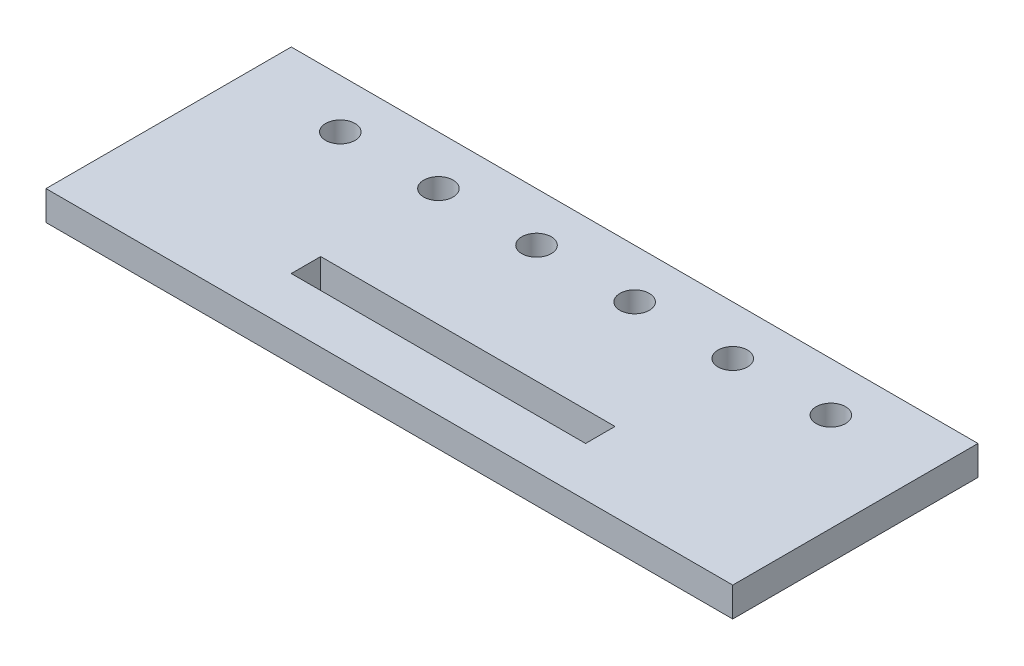
ISO-10303-21;
HEADER;
FILE_DESCRIPTION(('STEP AP214'),'2;1');
FILE_NAME('part.step','',(''),(''),'','','');
FILE_SCHEMA(('AUTOMOTIVE_DESIGN { 1 0 10303 214 1 1 1 1 }'));
ENDSEC;
DATA;
#1=APPLICATION_CONTEXT('core data for automotive mechanical design processes');
#2=APPLICATION_PROTOCOL_DEFINITION('international standard','automotive_design',2000,#1);
#3=PRODUCT_CONTEXT('',#1,'mechanical');
#4=PRODUCT('Part','Part','',(#3));
#5=PRODUCT_RELATED_PRODUCT_CATEGORY('part','',(#4));
#6=PRODUCT_DEFINITION_FORMATION('','',#4);
#7=PRODUCT_DEFINITION_CONTEXT('part definition',#1,'design');
#8=PRODUCT_DEFINITION('design','',#6,#7);
#9=PRODUCT_DEFINITION_SHAPE('','',#8);
#10=(LENGTH_UNIT() NAMED_UNIT(*) SI_UNIT(.MILLI.,.METRE.));
#11=(NAMED_UNIT(*) PLANE_ANGLE_UNIT() SI_UNIT($,.RADIAN.));
#12=(NAMED_UNIT(*) SI_UNIT($,.STERADIAN.) SOLID_ANGLE_UNIT());
#13=UNCERTAINTY_MEASURE_WITH_UNIT(LENGTH_MEASURE(1.E-05),#10,'distance_accuracy_value','');
#14=(GEOMETRIC_REPRESENTATION_CONTEXT(3) GLOBAL_UNCERTAINTY_ASSIGNED_CONTEXT((#13)) GLOBAL_UNIT_ASSIGNED_CONTEXT((#10,
#11,#12)) REPRESENTATION_CONTEXT('',''));
#15=CARTESIAN_POINT('',(0.,0.,0.));
#16=DIRECTION('',(0.,0.,1.));
#17=DIRECTION('',(1.,0.,0.));
#18=AXIS2_PLACEMENT_3D('',#15,#16,#17);
#19=CARTESIAN_POINT('',(0.,3.,0.));
#20=DIRECTION('',(0.,1.,0.));
#21=DIRECTION('',(0.,0.,1.));
#22=AXIS2_PLACEMENT_3D('',#19,#20,#21);
#23=PLANE('',#22);
#24=CARTESIAN_POINT('',(15.,3.,-7.5));
#25=DIRECTION('',(0.,1.,0.));
#26=DIRECTION('',(0.,0.,1.));
#27=AXIS2_PLACEMENT_3D('',#24,#25,#26);
#28=CIRCLE('',#27,1.5);
#29=CARTESIAN_POINT('',(15.,3.,-6.));
#30=VERTEX_POINT('',#29);
#31=EDGE_CURVE('E298',#30,#30,#28,.T.);
#32=ORIENTED_EDGE('',*,*,#31,.F.);
#33=EDGE_LOOP('',(#32));
#34=FACE_BOUND('',#33,.T.);
#35=CARTESIAN_POINT('',(-5.00000000000002,3.,-7.5));
#36=DIRECTION('',(0.,1.,0.));
#37=DIRECTION('',(0.,0.,1.));
#38=AXIS2_PLACEMENT_3D('',#35,#36,#37);
#39=CIRCLE('',#38,1.5);
#40=CARTESIAN_POINT('',(-5.00000000000002,3.,-6.));
#41=VERTEX_POINT('',#40);
#42=EDGE_CURVE('E314',#41,#41,#39,.T.);
#43=ORIENTED_EDGE('',*,*,#42,.F.);
#44=EDGE_LOOP('',(#43));
#45=FACE_BOUND('',#44,.T.);
#46=DIRECTION('',(-1.,0.,0.));
#47=VECTOR('',#46,1.);
#48=CARTESIAN_POINT('',(-15.,3.,4.5));
#49=LINE('',#48,#47);
#50=CARTESIAN_POINT('',(15.,3.,4.5));
#51=VERTEX_POINT('',#50);
#52=CARTESIAN_POINT('',(-15.,3.,4.5));
#53=VERTEX_POINT('',#52);
#54=EDGE_CURVE('E114',#51,#53,#49,.T.);
#55=ORIENTED_EDGE('',*,*,#54,.F.);
#56=DIRECTION('',(0.,0.,-1.));
#57=VECTOR('',#56,1.);
#58=CARTESIAN_POINT('',(15.,3.,4.5));
#59=LINE('',#58,#57);
#60=CARTESIAN_POINT('',(15.,3.,7.5));
#61=VERTEX_POINT('',#60);
#62=EDGE_CURVE('E105',#61,#51,#59,.T.);
#63=ORIENTED_EDGE('',*,*,#62,.F.);
#64=DIRECTION('',(1.,0.,0.));
#65=VECTOR('',#64,1.);
#66=CARTESIAN_POINT('',(-15.,3.,7.5));
#67=LINE('',#66,#65);
#68=CARTESIAN_POINT('',(-15.,3.,7.5));
#69=VERTEX_POINT('',#68);
#70=EDGE_CURVE('E132',#69,#61,#67,.T.);
#71=ORIENTED_EDGE('',*,*,#70,.F.);
#72=DIRECTION('',(0.,0.,1.));
#73=VECTOR('',#72,1.);
#74=CARTESIAN_POINT('',(-15.,3.,4.5));
#75=LINE('',#74,#73);
#76=EDGE_CURVE('E128',#53,#69,#75,.T.);
#77=ORIENTED_EDGE('',*,*,#76,.F.);
#78=EDGE_LOOP('',(#55,#63,#71,#77));
#79=FACE_BOUND('',#78,.T.);
#80=CARTESIAN_POINT('',(-25.,3.,-7.5));
#81=DIRECTION('',(0.,1.,0.));
#82=DIRECTION('',(0.,0.,1.));
#83=AXIS2_PLACEMENT_3D('',#80,#81,#82);
#84=CIRCLE('',#83,1.5);
#85=CARTESIAN_POINT('',(-25.,3.,-6.));
#86=VERTEX_POINT('',#85);
#87=EDGE_CURVE('E156',#86,#86,#84,.T.);
#88=ORIENTED_EDGE('',*,*,#87,.F.);
#89=EDGE_LOOP('',(#88));
#90=FACE_BOUND('',#89,.T.);
#91=DIRECTION('',(0.,0.,-1.));
#92=VECTOR('',#91,1.);
#93=CARTESIAN_POINT('',(35.,3.,-12.5));
#94=LINE('',#93,#92);
#95=CARTESIAN_POINT('',(35.,3.,12.5));
#96=VERTEX_POINT('',#95);
#97=CARTESIAN_POINT('',(35.,3.,-12.5));
#98=VERTEX_POINT('',#97);
#99=EDGE_CURVE('E164',#96,#98,#94,.T.);
#100=ORIENTED_EDGE('',*,*,#99,.T.);
#101=DIRECTION('',(-1.,0.,0.));
#102=VECTOR('',#101,1.);
#103=CARTESIAN_POINT('',(-35.,3.,-12.5));
#104=LINE('',#103,#102);
#105=CARTESIAN_POINT('',(-35.,3.,-12.5));
#106=VERTEX_POINT('',#105);
#107=EDGE_CURVE('E168',#98,#106,#104,.T.);
#108=ORIENTED_EDGE('',*,*,#107,.T.);
#109=DIRECTION('',(0.,0.,1.));
#110=VECTOR('',#109,1.);
#111=CARTESIAN_POINT('',(-35.,3.,-12.5));
#112=LINE('',#111,#110);
#113=CARTESIAN_POINT('',(-35.,3.,12.5));
#114=VERTEX_POINT('',#113);
#115=EDGE_CURVE('E172',#106,#114,#112,.T.);
#116=ORIENTED_EDGE('',*,*,#115,.T.);
#117=DIRECTION('',(1.,0.,0.));
#118=VECTOR('',#117,1.);
#119=CARTESIAN_POINT('',(-35.,3.,12.5));
#120=LINE('',#119,#118);
#121=EDGE_CURVE('E175',#114,#96,#120,.T.);
#122=ORIENTED_EDGE('',*,*,#121,.T.);
#123=EDGE_LOOP('',(#100,#108,#116,#122));
#124=FACE_BOUND('',#123,.T.);
#125=CARTESIAN_POINT('',(-15.,3.,-7.5));
#126=DIRECTION('',(0.,1.,0.));
#127=DIRECTION('',(0.,0.,1.));
#128=AXIS2_PLACEMENT_3D('',#125,#126,#127);
#129=CIRCLE('',#128,1.5);
#130=CARTESIAN_POINT('',(-15.,3.,-6.));
#131=VERTEX_POINT('',#130);
#132=EDGE_CURVE('E140',#131,#131,#129,.T.);
#133=ORIENTED_EDGE('',*,*,#132,.F.);
#134=EDGE_LOOP('',(#133));
#135=FACE_BOUND('',#134,.T.);
#136=CARTESIAN_POINT('',(4.99999999999999,3.,-7.5));
#137=DIRECTION('',(0.,1.,0.));
#138=DIRECTION('',(0.,0.,1.));
#139=AXIS2_PLACEMENT_3D('',#136,#137,#138);
#140=CIRCLE('',#139,1.50000000000002);
#141=CARTESIAN_POINT('',(4.99999999999999,3.,-5.99999999999998));
#142=VERTEX_POINT('',#141);
#143=EDGE_CURVE('E306',#142,#142,#140,.T.);
#144=ORIENTED_EDGE('',*,*,#143,.F.);
#145=EDGE_LOOP('',(#144));
#146=FACE_BOUND('',#145,.T.);
#147=CARTESIAN_POINT('',(25.,3.,-7.5));
#148=DIRECTION('',(0.,1.,0.));
#149=DIRECTION('',(0.,0.,1.));
#150=AXIS2_PLACEMENT_3D('',#147,#148,#149);
#151=CIRCLE('',#150,1.5);
#152=CARTESIAN_POINT('',(25.,3.,-6.));
#153=VERTEX_POINT('',#152);
#154=EDGE_CURVE('E287',#153,#153,#151,.T.);
#155=ORIENTED_EDGE('',*,*,#154,.F.);
#156=EDGE_LOOP('',(#155));
#157=FACE_BOUND('',#156,.T.);
#158=ADVANCED_FACE('F39',(#34,#45,#79,#90,#124,#135,#146,#157),#23,.T.);
#159=CARTESIAN_POINT('',(0.,0.,0.));
#160=DIRECTION('',(0.,1.,0.));
#161=DIRECTION('',(0.,0.,1.));
#162=AXIS2_PLACEMENT_3D('',#159,#160,#161);
#163=PLANE('',#162);
#164=CARTESIAN_POINT('',(-25.,0.,-7.5));
#165=DIRECTION('',(0.,1.,0.));
#166=DIRECTION('',(0.,0.,1.));
#167=AXIS2_PLACEMENT_3D('',#164,#165,#166);
#168=CIRCLE('',#167,1.5);
#169=CARTESIAN_POINT('',(-25.,0.,-6.));
#170=VERTEX_POINT('',#169);
#171=EDGE_CURVE('E123',#170,#170,#168,.T.);
#172=ORIENTED_EDGE('',*,*,#171,.T.);
#173=EDGE_LOOP('',(#172));
#174=FACE_BOUND('',#173,.T.);
#175=DIRECTION('',(0.,0.,-1.));
#176=VECTOR('',#175,1.);
#177=CARTESIAN_POINT('',(35.,0.,-12.5));
#178=LINE('',#177,#176);
#179=CARTESIAN_POINT('',(35.,0.,12.5));
#180=VERTEX_POINT('',#179);
#181=CARTESIAN_POINT('',(35.,0.,-12.5));
#182=VERTEX_POINT('',#181);
#183=EDGE_CURVE('E160',#180,#182,#178,.T.);
#184=ORIENTED_EDGE('',*,*,#183,.F.);
#185=DIRECTION('',(1.,0.,0.));
#186=VECTOR('',#185,1.);
#187=CARTESIAN_POINT('',(-35.,0.,12.5));
#188=LINE('',#187,#186);
#189=CARTESIAN_POINT('',(-35.,0.,12.5));
#190=VERTEX_POINT('',#189);
#191=EDGE_CURVE('E169',#190,#180,#188,.T.);
#192=ORIENTED_EDGE('',*,*,#191,.F.);
#193=DIRECTION('',(0.,0.,1.));
#194=VECTOR('',#193,1.);
#195=CARTESIAN_POINT('',(-35.,0.,-12.5));
#196=LINE('',#195,#194);
#197=CARTESIAN_POINT('',(-35.,0.,-12.5));
#198=VERTEX_POINT('',#197);
#199=EDGE_CURVE('E185',#198,#190,#196,.T.);
#200=ORIENTED_EDGE('',*,*,#199,.F.);
#201=DIRECTION('',(-1.,0.,0.));
#202=VECTOR('',#201,1.);
#203=CARTESIAN_POINT('',(-35.,0.,-12.5));
#204=LINE('',#203,#202);
#205=EDGE_CURVE('E182',#182,#198,#204,.T.);
#206=ORIENTED_EDGE('',*,*,#205,.F.);
#207=EDGE_LOOP('',(#184,#192,#200,#206));
#208=FACE_BOUND('',#207,.T.);
#209=DIRECTION('',(0.,0.,-1.));
#210=VECTOR('',#209,1.);
#211=CARTESIAN_POINT('',(15.,0.,4.5));
#212=LINE('',#211,#210);
#213=CARTESIAN_POINT('',(15.,0.,7.5));
#214=VERTEX_POINT('',#213);
#215=CARTESIAN_POINT('',(15.,0.,4.5));
#216=VERTEX_POINT('',#215);
#217=EDGE_CURVE('E63',#214,#216,#212,.T.);
#218=ORIENTED_EDGE('',*,*,#217,.T.);
#219=DIRECTION('',(-1.,0.,0.));
#220=VECTOR('',#219,1.);
#221=CARTESIAN_POINT('',(-15.,0.,4.5));
#222=LINE('',#221,#220);
#223=CARTESIAN_POINT('',(-15.,0.,4.5));
#224=VERTEX_POINT('',#223);
#225=EDGE_CURVE('E121',#216,#224,#222,.T.);
#226=ORIENTED_EDGE('',*,*,#225,.T.);
#227=DIRECTION('',(0.,0.,1.));
#228=VECTOR('',#227,1.);
#229=CARTESIAN_POINT('',(-15.,0.,4.5));
#230=LINE('',#229,#228);
#231=CARTESIAN_POINT('',(-15.,0.,7.5));
#232=VERTEX_POINT('',#231);
#233=EDGE_CURVE('E143',#224,#232,#230,.T.);
#234=ORIENTED_EDGE('',*,*,#233,.T.);
#235=DIRECTION('',(1.,0.,0.));
#236=VECTOR('',#235,1.);
#237=CARTESIAN_POINT('',(-15.,0.,7.5));
#238=LINE('',#237,#236);
#239=EDGE_CURVE('E115',#232,#214,#238,.T.);
#240=ORIENTED_EDGE('',*,*,#239,.T.);
#241=EDGE_LOOP('',(#218,#226,#234,#240));
#242=FACE_BOUND('',#241,.T.);
#243=CARTESIAN_POINT('',(-15.,0.,-7.5));
#244=DIRECTION('',(0.,1.,0.));
#245=DIRECTION('',(0.,0.,1.));
#246=AXIS2_PLACEMENT_3D('',#243,#244,#245);
#247=CIRCLE('',#246,1.5);
#248=CARTESIAN_POINT('',(-15.,0.,-6.));
#249=VERTEX_POINT('',#248);
#250=EDGE_CURVE('E318',#249,#249,#247,.T.);
#251=ORIENTED_EDGE('',*,*,#250,.T.);
#252=EDGE_LOOP('',(#251));
#253=FACE_BOUND('',#252,.T.);
#254=CARTESIAN_POINT('',(-5.00000000000002,0.,-7.5));
#255=DIRECTION('',(0.,1.,0.));
#256=DIRECTION('',(0.,0.,1.));
#257=AXIS2_PLACEMENT_3D('',#254,#255,#256);
#258=CIRCLE('',#257,1.5);
#259=CARTESIAN_POINT('',(-5.00000000000002,0.,-6.));
#260=VERTEX_POINT('',#259);
#261=EDGE_CURVE('E310',#260,#260,#258,.T.);
#262=ORIENTED_EDGE('',*,*,#261,.T.);
#263=EDGE_LOOP('',(#262));
#264=FACE_BOUND('',#263,.T.);
#265=CARTESIAN_POINT('',(4.99999999999999,0.,-7.5));
#266=DIRECTION('',(0.,1.,0.));
#267=DIRECTION('',(0.,0.,1.));
#268=AXIS2_PLACEMENT_3D('',#265,#266,#267);
#269=CIRCLE('',#268,1.50000000000002);
#270=CARTESIAN_POINT('',(4.99999999999999,0.,-5.99999999999998));
#271=VERTEX_POINT('',#270);
#272=EDGE_CURVE('E302',#271,#271,#269,.T.);
#273=ORIENTED_EDGE('',*,*,#272,.T.);
#274=EDGE_LOOP('',(#273));
#275=FACE_BOUND('',#274,.T.);
#276=CARTESIAN_POINT('',(15.,0.,-7.5));
#277=DIRECTION('',(0.,1.,0.));
#278=DIRECTION('',(0.,0.,1.));
#279=AXIS2_PLACEMENT_3D('',#276,#277,#278);
#280=CIRCLE('',#279,1.5);
#281=CARTESIAN_POINT('',(15.,0.,-6.));
#282=VERTEX_POINT('',#281);
#283=EDGE_CURVE('E295',#282,#282,#280,.T.);
#284=ORIENTED_EDGE('',*,*,#283,.T.);
#285=EDGE_LOOP('',(#284));
#286=FACE_BOUND('',#285,.T.);
#287=CARTESIAN_POINT('',(25.,0.,-7.5));
#288=DIRECTION('',(0.,1.,0.));
#289=DIRECTION('',(0.,0.,1.));
#290=AXIS2_PLACEMENT_3D('',#287,#288,#289);
#291=CIRCLE('',#290,1.5);
#292=CARTESIAN_POINT('',(25.,0.,-6.));
#293=VERTEX_POINT('',#292);
#294=EDGE_CURVE('E290',#293,#293,#291,.T.);
#295=ORIENTED_EDGE('',*,*,#294,.T.);
#296=EDGE_LOOP('',(#295));
#297=FACE_BOUND('',#296,.T.);
#298=ADVANCED_FACE('F208',(#174,#208,#242,#253,#264,#275,#286,#297),#163,.F.);
#299=CARTESIAN_POINT('',(35.,3.,-12.5));
#300=DIRECTION('',(-1.,0.,0.));
#301=DIRECTION('',(0.,0.,1.));
#302=AXIS2_PLACEMENT_3D('',#299,#300,#301);
#303=PLANE('',#302);
#304=ORIENTED_EDGE('',*,*,#183,.T.);
#305=DIRECTION('',(0.,-1.,0.));
#306=VECTOR('',#305,1.);
#307=CARTESIAN_POINT('',(35.,3.,-12.5));
#308=LINE('',#307,#306);
#309=EDGE_CURVE('E11',#98,#182,#308,.T.);
#310=ORIENTED_EDGE('',*,*,#309,.F.);
#311=ORIENTED_EDGE('',*,*,#99,.F.);
#312=DIRECTION('',(0.,-1.,0.));
#313=VECTOR('',#312,1.);
#314=CARTESIAN_POINT('',(35.,3.,12.5));
#315=LINE('',#314,#313);
#316=EDGE_CURVE('E178',#96,#180,#315,.T.);
#317=ORIENTED_EDGE('',*,*,#316,.T.);
#318=EDGE_LOOP('',(#304,#310,#311,#317));
#319=FACE_BOUND('',#318,.T.);
#320=ADVANCED_FACE('F41',(#319),#303,.F.);
#321=CARTESIAN_POINT('',(-35.,3.,-12.5));
#322=DIRECTION('',(0.,0.,1.));
#323=DIRECTION('',(1.,0.,0.));
#324=AXIS2_PLACEMENT_3D('',#321,#322,#323);
#325=PLANE('',#324);
#326=ORIENTED_EDGE('',*,*,#205,.T.);
#327=DIRECTION('',(0.,-1.,0.));
#328=VECTOR('',#327,1.);
#329=CARTESIAN_POINT('',(-35.,3.,-12.5));
#330=LINE('',#329,#328);
#331=EDGE_CURVE('E48',#106,#198,#330,.T.);
#332=ORIENTED_EDGE('',*,*,#331,.F.);
#333=ORIENTED_EDGE('',*,*,#107,.F.);
#334=ORIENTED_EDGE('',*,*,#309,.T.);
#335=EDGE_LOOP('',(#326,#332,#333,#334));
#336=FACE_BOUND('',#335,.T.);
#337=ADVANCED_FACE('F219',(#336),#325,.F.);
#338=CARTESIAN_POINT('',(-35.,3.,-12.5));
#339=DIRECTION('',(1.,0.,0.));
#340=DIRECTION('',(0.,0.,-1.));
#341=AXIS2_PLACEMENT_3D('',#338,#339,#340);
#342=PLANE('',#341);
#343=ORIENTED_EDGE('',*,*,#199,.T.);
#344=DIRECTION('',(0.,-1.,0.));
#345=VECTOR('',#344,1.);
#346=CARTESIAN_POINT('',(-35.,3.,12.5));
#347=LINE('',#346,#345);
#348=EDGE_CURVE('E193',#114,#190,#347,.T.);
#349=ORIENTED_EDGE('',*,*,#348,.F.);
#350=ORIENTED_EDGE('',*,*,#115,.F.);
#351=ORIENTED_EDGE('',*,*,#331,.T.);
#352=EDGE_LOOP('',(#343,#349,#350,#351));
#353=FACE_BOUND('',#352,.T.);
#354=ADVANCED_FACE('F202',(#353),#342,.F.);
#355=CARTESIAN_POINT('',(-35.,3.,12.5));
#356=DIRECTION('',(0.,0.,-1.));
#357=DIRECTION('',(-1.,0.,0.));
#358=AXIS2_PLACEMENT_3D('',#355,#356,#357);
#359=PLANE('',#358);
#360=ORIENTED_EDGE('',*,*,#191,.T.);
#361=ORIENTED_EDGE('',*,*,#316,.F.);
#362=ORIENTED_EDGE('',*,*,#121,.F.);
#363=ORIENTED_EDGE('',*,*,#348,.T.);
#364=EDGE_LOOP('',(#360,#361,#362,#363));
#365=FACE_BOUND('',#364,.T.);
#366=ADVANCED_FACE('F212',(#365),#359,.F.);
#367=CARTESIAN_POINT('',(-25.,3.,-7.5));
#368=DIRECTION('',(0.,-1.,0.));
#369=DIRECTION('',(0.,0.,-1.));
#370=AXIS2_PLACEMENT_3D('',#367,#368,#369);
#371=CYLINDRICAL_SURFACE('',#370,1.5);
#372=ORIENTED_EDGE('',*,*,#87,.T.);
#373=EDGE_LOOP('',(#372));
#374=FACE_BOUND('',#373,.T.);
#375=ORIENTED_EDGE('',*,*,#171,.F.);
#376=EDGE_LOOP('',(#375));
#377=FACE_BOUND('',#376,.T.);
#378=ADVANCED_FACE('F237',(#374,#377),#371,.F.);
#379=CARTESIAN_POINT('',(15.,3.,4.5));
#380=DIRECTION('',(-1.,0.,0.));
#381=DIRECTION('',(0.,0.,1.));
#382=AXIS2_PLACEMENT_3D('',#379,#380,#381);
#383=PLANE('',#382);
#384=ORIENTED_EDGE('',*,*,#217,.F.);
#385=DIRECTION('',(0.,-1.,0.));
#386=VECTOR('',#385,1.);
#387=CARTESIAN_POINT('',(15.,3.,7.5));
#388=LINE('',#387,#386);
#389=EDGE_CURVE('E109',#61,#214,#388,.T.);
#390=ORIENTED_EDGE('',*,*,#389,.F.);
#391=ORIENTED_EDGE('',*,*,#62,.T.);
#392=DIRECTION('',(0.,-1.,0.));
#393=VECTOR('',#392,1.);
#394=CARTESIAN_POINT('',(15.,3.,4.5));
#395=LINE('',#394,#393);
#396=EDGE_CURVE('E108',#51,#216,#395,.T.);
#397=ORIENTED_EDGE('',*,*,#396,.T.);
#398=EDGE_LOOP('',(#384,#390,#391,#397));
#399=FACE_BOUND('',#398,.T.);
#400=ADVANCED_FACE('F107',(#399),#383,.T.);
#401=CARTESIAN_POINT('',(-15.,3.,4.5));
#402=DIRECTION('',(0.,0.,1.));
#403=DIRECTION('',(1.,0.,0.));
#404=AXIS2_PLACEMENT_3D('',#401,#402,#403);
#405=PLANE('',#404);
#406=ORIENTED_EDGE('',*,*,#225,.F.);
#407=ORIENTED_EDGE('',*,*,#396,.F.);
#408=ORIENTED_EDGE('',*,*,#54,.T.);
#409=DIRECTION('',(0.,-1.,0.));
#410=VECTOR('',#409,1.);
#411=CARTESIAN_POINT('',(-15.,3.,4.5));
#412=LINE('',#411,#410);
#413=EDGE_CURVE('E124',#53,#224,#412,.T.);
#414=ORIENTED_EDGE('',*,*,#413,.T.);
#415=EDGE_LOOP('',(#406,#407,#408,#414));
#416=FACE_BOUND('',#415,.T.);
#417=ADVANCED_FACE('F118',(#416),#405,.T.);
#418=CARTESIAN_POINT('',(-15.,3.,4.5));
#419=DIRECTION('',(1.,0.,0.));
#420=DIRECTION('',(0.,0.,-1.));
#421=AXIS2_PLACEMENT_3D('',#418,#419,#420);
#422=PLANE('',#421);
#423=ORIENTED_EDGE('',*,*,#233,.F.);
#424=ORIENTED_EDGE('',*,*,#413,.F.);
#425=ORIENTED_EDGE('',*,*,#76,.T.);
#426=DIRECTION('',(0.,-1.,0.));
#427=VECTOR('',#426,1.);
#428=CARTESIAN_POINT('',(-15.,3.,7.5));
#429=LINE('',#428,#427);
#430=EDGE_CURVE('E55',#69,#232,#429,.T.);
#431=ORIENTED_EDGE('',*,*,#430,.T.);
#432=EDGE_LOOP('',(#423,#424,#425,#431));
#433=FACE_BOUND('',#432,.T.);
#434=ADVANCED_FACE('F254',(#433),#422,.T.);
#435=CARTESIAN_POINT('',(-15.,3.,7.5));
#436=DIRECTION('',(0.,0.,-1.));
#437=DIRECTION('',(-1.,0.,0.));
#438=AXIS2_PLACEMENT_3D('',#435,#436,#437);
#439=PLANE('',#438);
#440=ORIENTED_EDGE('',*,*,#239,.F.);
#441=ORIENTED_EDGE('',*,*,#430,.F.);
#442=ORIENTED_EDGE('',*,*,#70,.T.);
#443=ORIENTED_EDGE('',*,*,#389,.T.);
#444=EDGE_LOOP('',(#440,#441,#442,#443));
#445=FACE_BOUND('',#444,.T.);
#446=ADVANCED_FACE('F259',(#445),#439,.T.);
#447=CARTESIAN_POINT('',(-15.,3.,-7.5));
#448=DIRECTION('',(0.,-1.,0.));
#449=DIRECTION('',(0.,0.,-1.));
#450=AXIS2_PLACEMENT_3D('',#447,#448,#449);
#451=CYLINDRICAL_SURFACE('',#450,1.5);
#452=ORIENTED_EDGE('',*,*,#132,.T.);
#453=EDGE_LOOP('',(#452));
#454=FACE_BOUND('',#453,.T.);
#455=ORIENTED_EDGE('',*,*,#250,.F.);
#456=EDGE_LOOP('',(#455));
#457=FACE_BOUND('',#456,.T.);
#458=ADVANCED_FACE('F263',(#454,#457),#451,.F.);
#459=CARTESIAN_POINT('',(-5.00000000000002,3.,-7.5));
#460=DIRECTION('',(0.,-1.,0.));
#461=DIRECTION('',(0.,0.,-1.));
#462=AXIS2_PLACEMENT_3D('',#459,#460,#461);
#463=CYLINDRICAL_SURFACE('',#462,1.5);
#464=ORIENTED_EDGE('',*,*,#42,.T.);
#465=EDGE_LOOP('',(#464));
#466=FACE_BOUND('',#465,.T.);
#467=ORIENTED_EDGE('',*,*,#261,.F.);
#468=EDGE_LOOP('',(#467));
#469=FACE_BOUND('',#468,.T.);
#470=ADVANCED_FACE('F266',(#466,#469),#463,.F.);
#471=CARTESIAN_POINT('',(4.99999999999999,3.,-7.5));
#472=DIRECTION('',(0.,-1.,0.));
#473=DIRECTION('',(0.,0.,-1.));
#474=AXIS2_PLACEMENT_3D('',#471,#472,#473);
#475=CYLINDRICAL_SURFACE('',#474,1.50000000000002);
#476=ORIENTED_EDGE('',*,*,#143,.T.);
#477=EDGE_LOOP('',(#476));
#478=FACE_BOUND('',#477,.T.);
#479=ORIENTED_EDGE('',*,*,#272,.F.);
#480=EDGE_LOOP('',(#479));
#481=FACE_BOUND('',#480,.T.);
#482=ADVANCED_FACE('F270',(#478,#481),#475,.F.);
#483=CARTESIAN_POINT('',(15.,3.,-7.5));
#484=DIRECTION('',(0.,-1.,0.));
#485=DIRECTION('',(0.,0.,-1.));
#486=AXIS2_PLACEMENT_3D('',#483,#484,#485);
#487=CYLINDRICAL_SURFACE('',#486,1.5);
#488=ORIENTED_EDGE('',*,*,#31,.T.);
#489=EDGE_LOOP('',(#488));
#490=FACE_BOUND('',#489,.T.);
#491=ORIENTED_EDGE('',*,*,#283,.F.);
#492=EDGE_LOOP('',(#491));
#493=FACE_BOUND('',#492,.T.);
#494=ADVANCED_FACE('F274',(#490,#493),#487,.F.);
#495=CARTESIAN_POINT('',(25.,3.,-7.5));
#496=DIRECTION('',(0.,-1.,0.));
#497=DIRECTION('',(0.,0.,-1.));
#498=AXIS2_PLACEMENT_3D('',#495,#496,#497);
#499=CYLINDRICAL_SURFACE('',#498,1.5);
#500=ORIENTED_EDGE('',*,*,#154,.T.);
#501=EDGE_LOOP('',(#500));
#502=FACE_BOUND('',#501,.T.);
#503=ORIENTED_EDGE('',*,*,#294,.F.);
#504=EDGE_LOOP('',(#503));
#505=FACE_BOUND('',#504,.T.);
#506=ADVANCED_FACE('F278',(#502,#505),#499,.F.);
#507=CLOSED_SHELL('',(#158,#298,#320,#337,#354,#366,#378,#400,#417,#434,#446,#458,#470,#482,
#494,#506));
#508=MANIFOLD_SOLID_BREP('B2',#507);
#509=ADVANCED_BREP_SHAPE_REPRESENTATION('',(#18,#508),#14);
#510=SHAPE_DEFINITION_REPRESENTATION(#9,#509);
ENDSEC;
END-ISO-10303-21;
